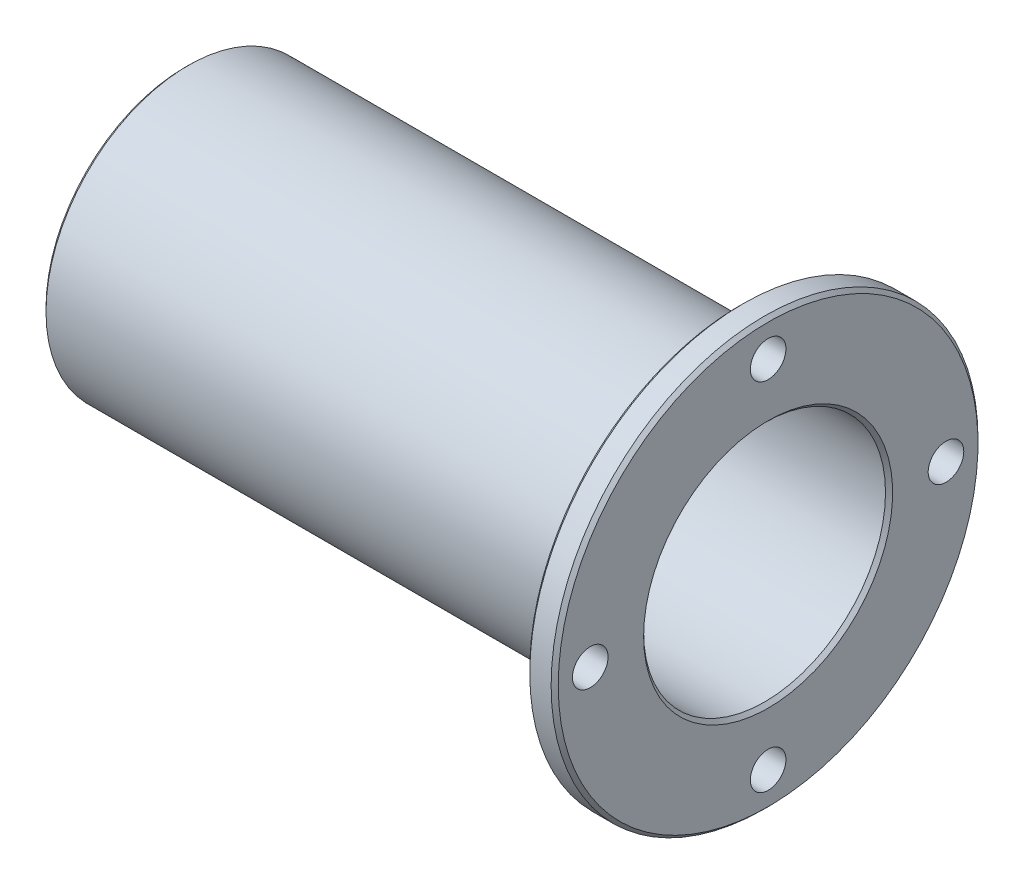
ISO-10303-21;
HEADER;
FILE_DESCRIPTION(('STEP AP214'),'2;1');
FILE_NAME('part.step','',(''),(''),'','','');
FILE_SCHEMA(('AUTOMOTIVE_DESIGN { 1 0 10303 214 1 1 1 1 }'));
ENDSEC;
DATA;
#1=APPLICATION_CONTEXT('core data for automotive mechanical design processes');
#2=APPLICATION_PROTOCOL_DEFINITION('international standard','automotive_design',2000,#1);
#3=PRODUCT_CONTEXT('',#1,'mechanical');
#4=PRODUCT('Part','Part','',(#3));
#5=PRODUCT_RELATED_PRODUCT_CATEGORY('part','',(#4));
#6=PRODUCT_DEFINITION_FORMATION('','',#4);
#7=PRODUCT_DEFINITION_CONTEXT('part definition',#1,'design');
#8=PRODUCT_DEFINITION('design','',#6,#7);
#9=PRODUCT_DEFINITION_SHAPE('','',#8);
#10=(LENGTH_UNIT() NAMED_UNIT(*) SI_UNIT(.MILLI.,.METRE.));
#11=(NAMED_UNIT(*) PLANE_ANGLE_UNIT() SI_UNIT($,.RADIAN.));
#12=(NAMED_UNIT(*) SI_UNIT($,.STERADIAN.) SOLID_ANGLE_UNIT());
#13=UNCERTAINTY_MEASURE_WITH_UNIT(LENGTH_MEASURE(1.E-05),#10,'distance_accuracy_value','');
#14=(GEOMETRIC_REPRESENTATION_CONTEXT(3) GLOBAL_UNCERTAINTY_ASSIGNED_CONTEXT((#13)) GLOBAL_UNIT_ASSIGNED_CONTEXT((#10,
#11,#12)) REPRESENTATION_CONTEXT('',''));
#15=CARTESIAN_POINT('',(0.,0.,0.));
#16=DIRECTION('',(0.,0.,1.));
#17=DIRECTION('',(1.,0.,0.));
#18=AXIS2_PLACEMENT_3D('',#15,#16,#17);
#19=CARTESIAN_POINT('',(0.,10.,0.));
#20=DIRECTION('',(1.,0.,0.));
#21=DIRECTION('',(0.,0.,-1.));
#22=AXIS2_PLACEMENT_3D('',#19,#20,#21);
#23=PLANE('',#22);
#24=CARTESIAN_POINT('',(0.,0.,0.));
#25=DIRECTION('',(1.,0.,0.));
#26=DIRECTION('',(0.,0.,-1.));
#27=AXIS2_PLACEMENT_3D('',#24,#25,#26);
#28=CIRCLE('',#27,19.5);
#29=CARTESIAN_POINT('',(0.,0.,-19.5));
#30=VERTEX_POINT('',#29);
#31=EDGE_CURVE('E128',#30,#30,#28,.F.);
#32=ORIENTED_EDGE('',*,*,#31,.T.);
#33=EDGE_LOOP('',(#32));
#34=FACE_BOUND('',#33,.T.);
#35=CARTESIAN_POINT('',(0.,0.,0.));
#36=DIRECTION('',(-1.,0.,0.));
#37=DIRECTION('',(0.,0.,1.));
#38=AXIS2_PLACEMENT_3D('',#35,#36,#37);
#39=CIRCLE('',#38,10.);
#40=CARTESIAN_POINT('',(0.,9.83375,-1.81586368912978));
#41=VERTEX_POINT('',#40);
#42=CARTESIAN_POINT('',(0.,1.81586368912978,-9.83375));
#43=VERTEX_POINT('',#42);
#44=EDGE_CURVE('E83',#41,#43,#39,.T.);
#45=ORIENTED_EDGE('',*,*,#44,.F.);
#46=CARTESIAN_POINT('',(0.,13.,0.));
#47=DIRECTION('',(-1.,0.,0.));
#48=DIRECTION('',(0.,0.,1.));
#49=AXIS2_PLACEMENT_3D('',#46,#47,#48);
#50=CIRCLE('',#49,3.65);
#51=CARTESIAN_POINT('',(0.,9.83375,1.81586368912978));
#52=VERTEX_POINT('',#51);
#53=EDGE_CURVE('E52',#52,#41,#50,.T.);
#54=ORIENTED_EDGE('',*,*,#53,.F.);
#55=CARTESIAN_POINT('',(0.,1.81586368912977,9.83375));
#56=VERTEX_POINT('',#55);
#57=EDGE_CURVE('E81',#56,#52,#39,.T.);
#58=ORIENTED_EDGE('',*,*,#57,.F.);
#59=CARTESIAN_POINT('',(0.,0.,13.));
#60=DIRECTION('',(-1.,0.,0.));
#61=DIRECTION('',(0.,0.,1.));
#62=AXIS2_PLACEMENT_3D('',#59,#60,#61);
#63=CIRCLE('',#62,3.65);
#64=CARTESIAN_POINT('',(0.,-1.81586368912978,9.83375));
#65=VERTEX_POINT('',#64);
#66=EDGE_CURVE('E58',#65,#56,#63,.T.);
#67=ORIENTED_EDGE('',*,*,#66,.F.);
#68=CARTESIAN_POINT('',(0.,-9.83375,1.81586368912978));
#69=VERTEX_POINT('',#68);
#70=EDGE_CURVE('E89',#69,#65,#39,.T.);
#71=ORIENTED_EDGE('',*,*,#70,.F.);
#72=CARTESIAN_POINT('',(0.,-13.,0.));
#73=DIRECTION('',(-1.,0.,0.));
#74=DIRECTION('',(0.,0.,1.));
#75=AXIS2_PLACEMENT_3D('',#72,#73,#74);
#76=CIRCLE('',#75,3.65);
#77=CARTESIAN_POINT('',(0.,-9.83375,-1.81586368912978));
#78=VERTEX_POINT('',#77);
#79=EDGE_CURVE('E410',#78,#69,#76,.T.);
#80=ORIENTED_EDGE('',*,*,#79,.F.);
#81=CARTESIAN_POINT('',(0.,-1.81586368912977,-9.83375));
#82=VERTEX_POINT('',#81);
#83=EDGE_CURVE('E91',#82,#78,#39,.T.);
#84=ORIENTED_EDGE('',*,*,#83,.F.);
#85=CARTESIAN_POINT('',(0.,0.,-13.));
#86=DIRECTION('',(-1.,0.,0.));
#87=DIRECTION('',(0.,0.,1.));
#88=AXIS2_PLACEMENT_3D('',#85,#86,#87);
#89=CIRCLE('',#88,3.65);
#90=EDGE_CURVE('E434',#43,#82,#89,.T.);
#91=ORIENTED_EDGE('',*,*,#90,.F.);
#92=EDGE_LOOP('',(#45,#54,#58,#67,#71,#80,#84,#91));
#93=FACE_BOUND('',#92,.T.);
#94=ADVANCED_FACE('F37',(#34,#93),#23,.F.);
#95=CARTESIAN_POINT('',(0.,0.,0.));
#96=DIRECTION('',(-1.,0.,0.));
#97=DIRECTION('',(0.,0.,1.));
#98=AXIS2_PLACEMENT_3D('',#95,#96,#97);
#99=CYLINDRICAL_SURFACE('',#98,10.);
#100=CARTESIAN_POINT('',(3.49999999999998,0.,0.));
#101=DIRECTION('',(-1.,0.,0.));
#102=DIRECTION('',(0.,0.,1.));
#103=AXIS2_PLACEMENT_3D('',#100,#101,#102);
#104=CIRCLE('',#103,10.);
#105=CARTESIAN_POINT('',(3.49999999999998,0.,10.));
#106=VERTEX_POINT('',#105);
#107=EDGE_CURVE('E125',#106,#106,#104,.F.);
#108=ORIENTED_EDGE('',*,*,#107,.T.);
#109=EDGE_LOOP('',(#108));
#110=FACE_BOUND('',#109,.T.);
#111=ORIENTED_EDGE('',*,*,#57,.T.);
#112=CARTESIAN_POINT('',(-0.0002,9.83369384461539,1.81616777043683));
#113=CARTESIAN_POINT('',(0.0328787074453799,9.84298247485663,1.76586869999737));
#114=CARTESIAN_POINT('',(0.0653133556671312,9.85196258783882,1.71509050066129));
#115=CARTESIAN_POINT('',(0.128675248379261,9.86927975905654,1.61246119724076));
#116=CARTESIAN_POINT('',(0.159601749786157,9.87761650145022,1.56060958183999));
#117=CARTESIAN_POINT('',(0.25021961324618,9.90173652876115,1.40251370575922));
#118=CARTESIAN_POINT('',(0.3072157008299,9.91648087756967,1.29452513394009));
#119=CARTESIAN_POINT('',(0.412008401666546,9.94300737345037,1.07206069061352));
#120=CARTESIAN_POINT('',(0.459680169335041,9.95474989248205,0.957520264658974));
#121=CARTESIAN_POINT('',(0.541093632656455,9.97447605265071,0.72353708546845));
#122=CARTESIAN_POINT('',(0.574884868167065,9.98247307611376,0.604113469027235));
#123=CARTESIAN_POINT('',(0.613686997977575,9.99157651562064,0.415825786808179));
#124=CARTESIAN_POINT('',(0.624809662141635,9.99416492827858,0.34827177800218));
#125=CARTESIAN_POINT('',(0.641226096347715,9.99797498582,0.212390020902549));
#126=CARTESIAN_POINT('',(0.646518770548608,9.99919637374971,0.144062129582799));
#127=CARTESIAN_POINT('',(0.650983860898503,10.0002271905596,0.00778456549395661));
#128=CARTESIAN_POINT('',(0.650208568201649,10.0000486831154,-0.0601633000237445));
#129=CARTESIAN_POINT('',(0.642702908742275,9.99831453758039,-0.195704816622554));
#130=CARTESIAN_POINT('',(0.635972736166017,9.99675894439581,-0.263298479181779));
#131=CARTESIAN_POINT('',(0.616926127332752,9.99232889917011,-0.397282549825774));
#132=CARTESIAN_POINT('',(0.604638915939702,9.98946134591503,-0.463677386597749));
#133=CARTESIAN_POINT('',(0.575000872607087,9.98248463259256,-0.595272016060319));
#134=CARTESIAN_POINT('',(0.557647567217013,9.97837486599692,-0.660471208428571));
#135=CARTESIAN_POINT('',(0.498630330019979,9.96424657656146,-0.854828811513095));
#136=CARTESIAN_POINT('',(0.45015503104972,9.95246155367515,-0.981823088470965));
#137=CARTESIAN_POINT('',(0.367341421754855,9.93172825990159,-1.16823231543496));
#138=CARTESIAN_POINT('',(0.337820361860381,9.92424709027715,-1.23008962809087));
#139=CARTESIAN_POINT('',(0.275951689702965,9.90833667551114,-1.35227772997223));
#140=CARTESIAN_POINT('',(0.243603597146367,9.89990726920045,-1.41260825755325));
#141=CARTESIAN_POINT('',(0.177065528722365,9.88230055834575,-1.53090225899771));
#142=CARTESIAN_POINT('',(0.142910759727775,9.87313647572071,-1.58888772303072));
#143=CARTESIAN_POINT('',(0.0726989004210404,9.85400609157192,-1.70350443935433));
#144=CARTESIAN_POINT('',(0.0366431867581044,9.84404036791372,-1.76013662962984));
#145=CARTESIAN_POINT('',(-0.000200000000194953,9.83369384461533,-1.81616777043713));
#146=B_SPLINE_CURVE_WITH_KNOTS('',3,(#112,#113,#114,#115,#116,#117,#118,#119,#120,#121,#122,
#123,#124,#125,#126,#127,#128,#129,#130,#131,#132,#133,#134,#135,#136,#137,#138,#139,#140,#141,
#142,#143,#144,#145),.UNSPECIFIED.,.F.,.F.,(4,2,2,2,2,2,2,2,2,2,2,2,2,2,2,2,4),(0.,
0.182728437677652,0.365546016717099,0.734086438199131,1.10726643222343,1.47910271941134,
1.68440947502773,1.88975481479546,2.09333253685044,2.29690362056161,2.49941633946095,
2.70202809823218,3.11003246287906,3.31683113680386,3.52366501297412,3.72737432218258,
3.93093808064405),.UNSPECIFIED.);
#147=EDGE_CURVE('E11',#52,#41,#146,.T.);
#148=ORIENTED_EDGE('',*,*,#147,.T.);
#149=ORIENTED_EDGE('',*,*,#44,.T.);
#150=CARTESIAN_POINT('',(-0.0002,1.81616777043683,-9.83369384461539));
#151=CARTESIAN_POINT('',(0.0328787074453799,1.76586869999737,-9.84298247485663));
#152=CARTESIAN_POINT('',(0.0653133556671312,1.71509050066129,-9.85196258783882));
#153=CARTESIAN_POINT('',(0.128675248379261,1.61246119724076,-9.86927975905654));
#154=CARTESIAN_POINT('',(0.159601749786157,1.56060958183999,-9.87761650145022));
#155=CARTESIAN_POINT('',(0.25021961324618,1.40251370575922,-9.90173652876115));
#156=CARTESIAN_POINT('',(0.3072157008299,1.29452513394009,-9.91648087756967));
#157=CARTESIAN_POINT('',(0.412008401666545,1.07206069061352,-9.94300737345037));
#158=CARTESIAN_POINT('',(0.45968016933504,0.957520264658974,-9.95474989248205));
#159=CARTESIAN_POINT('',(0.541093632656454,0.72353708546845,-9.97447605265071));
#160=CARTESIAN_POINT('',(0.574884868167064,0.604113469027235,-9.98247307611376));
#161=CARTESIAN_POINT('',(0.613686997977575,0.41582578680818,-9.99157651562064));
#162=CARTESIAN_POINT('',(0.624809662141634,0.348271778002181,-9.99416492827858));
#163=CARTESIAN_POINT('',(0.641226096347714,0.21239002090255,-9.99797498582));
#164=CARTESIAN_POINT('',(0.646518770548608,0.1440621295828,-9.99919637374971));
#165=CARTESIAN_POINT('',(0.650983860898502,0.00778456549395779,-10.0002271905596));
#166=CARTESIAN_POINT('',(0.650208568201648,-0.0601633000237433,-10.0000486831154));
#167=CARTESIAN_POINT('',(0.642702908742274,-0.195704816622553,-9.99831453758039));
#168=CARTESIAN_POINT('',(0.635972736166017,-0.263298479181778,-9.99675894439581));
#169=CARTESIAN_POINT('',(0.616926127332751,-0.397282549825773,-9.99232889917011));
#170=CARTESIAN_POINT('',(0.6046389159397,-0.463677386597747,-9.98946134591503));
#171=CARTESIAN_POINT('',(0.575000872607085,-0.595272016060317,-9.98248463259256));
#172=CARTESIAN_POINT('',(0.557647567217014,-0.66047120842857,-9.97837486599692));
#173=CARTESIAN_POINT('',(0.498630330019982,-0.854828811513095,-9.96424657656147));
#174=CARTESIAN_POINT('',(0.450155031049722,-0.981823088470965,-9.95246155367515));
#175=CARTESIAN_POINT('',(0.367341421754856,-1.16823231543496,-9.93172825990159));
#176=CARTESIAN_POINT('',(0.337820361860381,-1.23008962809087,-9.92424709027715));
#177=CARTESIAN_POINT('',(0.275951689702965,-1.35227772997223,-9.90833667551114));
#178=CARTESIAN_POINT('',(0.243603597146367,-1.41260825755325,-9.89990726920045));
#179=CARTESIAN_POINT('',(0.177065528722365,-1.53090225899771,-9.88230055834575));
#180=CARTESIAN_POINT('',(0.142910759727775,-1.58888772303072,-9.87313647572071));
#181=CARTESIAN_POINT('',(0.0726989004210404,-1.70350443935433,-9.85400609157192));
#182=CARTESIAN_POINT('',(0.0366431867581042,-1.76013662962984,-9.84404036791372));
#183=CARTESIAN_POINT('',(-0.000200000000195297,-1.81616777043713,-9.83369384461533));
#184=B_SPLINE_CURVE_WITH_KNOTS('',3,(#150,#151,#152,#153,#154,#155,#156,#157,#158,#159,#160,
#161,#162,#163,#164,#165,#166,#167,#168,#169,#170,#171,#172,#173,#174,#175,#176,#177,#178,#179,
#180,#181,#182,#183),.UNSPECIFIED.,.F.,.F.,(4,2,2,2,2,2,2,2,2,2,2,2,2,2,2,2,4),(0.,
0.182728437677652,0.365546016717099,0.734086438199131,1.10726643222343,1.47910271941133,
1.68440947502773,1.88975481479546,2.09333253685044,2.29690362056161,2.49941633946095,
2.70202809823217,3.11003246287905,3.31683113680386,3.52366501297412,3.72737432218258,
3.93093808064405),.UNSPECIFIED.);
#185=EDGE_CURVE('E134',#43,#82,#184,.T.);
#186=ORIENTED_EDGE('',*,*,#185,.T.);
#187=ORIENTED_EDGE('',*,*,#83,.T.);
#188=CARTESIAN_POINT('',(-0.000200000000195393,-9.83369384461533,-1.81616777043713));
#189=CARTESIAN_POINT('',(0.0328787074451947,-9.84298247485658,-1.76586869999766));
#190=CARTESIAN_POINT('',(0.0653133556669557,-9.85196258783877,-1.71509050066157));
#191=CARTESIAN_POINT('',(0.128675248379105,-9.86927975905649,-1.61246119724102));
#192=CARTESIAN_POINT('',(0.15960174978601,-9.87761650145018,-1.56060958184024));
#193=CARTESIAN_POINT('',(0.250219613246061,-9.90173652876112,-1.40251370575944));
#194=CARTESIAN_POINT('',(0.3072157008298,-9.91648087756964,-1.29452513394029));
#195=CARTESIAN_POINT('',(0.41200840166648,-9.94300737345035,-1.07206069061368));
#196=CARTESIAN_POINT('',(0.459680169334989,-9.95474989248204,-0.957520264659105));
#197=CARTESIAN_POINT('',(0.54109363265643,-9.9744760526507,-0.72353708546853));
#198=CARTESIAN_POINT('',(0.574884868167051,-9.98247307611376,-0.604113469027289));
#199=CARTESIAN_POINT('',(0.613686997977571,-9.99157651562064,-0.415825786808206));
#200=CARTESIAN_POINT('',(0.624809662141632,-9.99416492827858,-0.348271778002205));
#201=CARTESIAN_POINT('',(0.641226096347713,-9.99797498582,-0.212390020902572));
#202=CARTESIAN_POINT('',(0.646518770548607,-9.99919637374971,-0.14406212958282));
#203=CARTESIAN_POINT('',(0.650983860898502,-10.0002271905596,-0.00778456549397483));
#204=CARTESIAN_POINT('',(0.650208568201649,-10.0000486831154,0.0601633000237276));
#205=CARTESIAN_POINT('',(0.642702908742276,-9.99831453758039,0.19570481662254));
#206=CARTESIAN_POINT('',(0.635972736166019,-9.99675894439581,0.263298479181767));
#207=CARTESIAN_POINT('',(0.616926127332753,-9.99232889917011,0.397282549825764));
#208=CARTESIAN_POINT('',(0.604638915939703,-9.98946134591503,0.46367738659774));
#209=CARTESIAN_POINT('',(0.575000872607088,-9.98248463259256,0.595272016060312));
#210=CARTESIAN_POINT('',(0.557647567217014,-9.97837486599692,0.660471208428566));
#211=CARTESIAN_POINT('',(0.498630330019979,-9.96424657656146,0.854828811513094));
#212=CARTESIAN_POINT('',(0.45015503104972,-9.95246155367515,0.981823088470967));
#213=CARTESIAN_POINT('',(0.367341421754866,-9.93172825990159,1.16823231543493));
#214=CARTESIAN_POINT('',(0.337820361860405,-9.92424709027716,1.23008962809082));
#215=CARTESIAN_POINT('',(0.27595168970302,-9.90833667551115,1.35227772997213));
#216=CARTESIAN_POINT('',(0.243603597146437,-9.89990726920047,1.41260825755312));
#217=CARTESIAN_POINT('',(0.177065528722469,-9.88230055834578,1.53090225899753));
#218=CARTESIAN_POINT('',(0.142910759727896,-9.87313647572074,1.58888772303051));
#219=CARTESIAN_POINT('',(0.0726989004211967,-9.85400609157196,1.70350443935408));
#220=CARTESIAN_POINT('',(0.0366431867582795,-9.84404036791377,1.76013662962957));
#221=CARTESIAN_POINT('',(-0.000199999999999425,-9.83369384461539,1.81616777043683));
#222=B_SPLINE_CURVE_WITH_KNOTS('',3,(#188,#189,#190,#191,#192,#193,#194,#195,#196,#197,#198,
#199,#200,#201,#202,#203,#204,#205,#206,#207,#208,#209,#210,#211,#212,#213,#214,#215,#216,#217,
#218,#219,#220,#221),.UNSPECIFIED.,.F.,.F.,(4,2,2,2,2,2,2,2,2,2,2,2,2,2,2,2,4),(0.,
0.182728437677692,0.365546016717178,0.734086438199293,1.10726643222368,1.47910271941167,
1.68440947502807,1.8897548147958,2.09333253685079,2.29690362056196,2.4994163394613,
2.70202809823253,3.11003246287942,3.31683113680413,3.5236650129743,3.72737432218267,
3.93093808064405),.UNSPECIFIED.);
#223=EDGE_CURVE('E142',#78,#69,#222,.T.);
#224=ORIENTED_EDGE('',*,*,#223,.T.);
#225=ORIENTED_EDGE('',*,*,#70,.T.);
#226=CARTESIAN_POINT('',(-0.000200000000195087,-1.81616777043713,9.83369384461533));
#227=CARTESIAN_POINT('',(0.0328787074451947,-1.76586869999766,9.84298247485658));
#228=CARTESIAN_POINT('',(0.0653133556669556,-1.71509050066157,9.85196258783877));
#229=CARTESIAN_POINT('',(0.128675248379105,-1.61246119724102,9.86927975905649));
#230=CARTESIAN_POINT('',(0.159601749786009,-1.56060958184024,9.87761650145019));
#231=CARTESIAN_POINT('',(0.25021961324606,-1.40251370575944,9.90173652876112));
#232=CARTESIAN_POINT('',(0.307215700829798,-1.29452513394029,9.91648087756964));
#233=CARTESIAN_POINT('',(0.412008401666477,-1.07206069061368,9.94300737345035));
#234=CARTESIAN_POINT('',(0.459680169334989,-0.957520264659105,9.95474989248204));
#235=CARTESIAN_POINT('',(0.54109363265643,-0.723537085468531,9.9744760526507));
#236=CARTESIAN_POINT('',(0.574884868167051,-0.60411346902729,9.98247307611376));
#237=CARTESIAN_POINT('',(0.61368699797757,-0.415825786808207,9.99157651562064));
#238=CARTESIAN_POINT('',(0.624809662141631,-0.348271778002206,9.99416492827858));
#239=CARTESIAN_POINT('',(0.641226096347713,-0.212390020902573,9.99797498582));
#240=CARTESIAN_POINT('',(0.646518770548606,-0.144062129582821,9.99919637374971));
#241=CARTESIAN_POINT('',(0.650983860898502,-0.00778456549397607,10.0002271905596));
#242=CARTESIAN_POINT('',(0.650208568201649,0.0601633000237264,10.0000486831154));
#243=CARTESIAN_POINT('',(0.642702908742276,0.195704816622539,9.99831453758039));
#244=CARTESIAN_POINT('',(0.635972736166019,0.263298479181765,9.99675894439581));
#245=CARTESIAN_POINT('',(0.616926127332753,0.397282549825762,9.99232889917011));
#246=CARTESIAN_POINT('',(0.604638915939703,0.463677386597738,9.98946134591503));
#247=CARTESIAN_POINT('',(0.575000872607087,0.595272016060311,9.98248463259256));
#248=CARTESIAN_POINT('',(0.557647567217014,0.660471208428564,9.97837486599692));
#249=CARTESIAN_POINT('',(0.49863033001998,0.854828811513092,9.96424657656146));
#250=CARTESIAN_POINT('',(0.45015503104972,0.981823088470965,9.95246155367515));
#251=CARTESIAN_POINT('',(0.367341421754866,1.16823231543493,9.93172825990159));
#252=CARTESIAN_POINT('',(0.337820361860405,1.23008962809082,9.92424709027716));
#253=CARTESIAN_POINT('',(0.27595168970302,1.35227772997212,9.90833667551115));
#254=CARTESIAN_POINT('',(0.243603597146437,1.41260825755312,9.89990726920047));
#255=CARTESIAN_POINT('',(0.177065528722469,1.53090225899753,9.88230055834578));
#256=CARTESIAN_POINT('',(0.142910759727896,1.58888772303051,9.87313647572074));
#257=CARTESIAN_POINT('',(0.0726989004211969,1.70350443935408,9.85400609157196));
#258=CARTESIAN_POINT('',(0.0366431867582798,1.76013662962957,9.84404036791377));
#259=CARTESIAN_POINT('',(-0.000199999999999313,1.81616777043683,9.83369384461539));
#260=B_SPLINE_CURVE_WITH_KNOTS('',3,(#226,#227,#228,#229,#230,#231,#232,#233,#234,#235,#236,
#237,#238,#239,#240,#241,#242,#243,#244,#245,#246,#247,#248,#249,#250,#251,#252,#253,#254,#255,
#256,#257,#258,#259),.UNSPECIFIED.,.F.,.F.,(4,2,2,2,2,2,2,2,2,2,2,2,2,2,2,2,4),(0.,
0.182728437677691,0.365546016717178,0.734086438199292,1.10726643222368,1.47910271941166,
1.68440947502806,1.8897548147958,2.09333253685078,2.29690362056195,2.4994163394613,
2.70202809823253,3.11003246287942,3.31683113680413,3.52366501297429,3.72737432218267,
3.93093808064405),.UNSPECIFIED.);
#261=EDGE_CURVE('E46',#65,#56,#260,.T.);
#262=ORIENTED_EDGE('',*,*,#261,.T.);
#263=EDGE_LOOP('',(#111,#148,#149,#186,#187,#224,#225,#262));
#264=FACE_BOUND('',#263,.T.);
#265=ADVANCED_FACE('F87',(#110,#264),#99,.F.);
#266=CARTESIAN_POINT('',(4.,10.,0.));
#267=DIRECTION('',(-1.,0.,0.));
#268=DIRECTION('',(0.,0.,1.));
#269=AXIS2_PLACEMENT_3D('',#266,#267,#268);
#270=PLANE('',#269);
#271=CARTESIAN_POINT('',(4.,13.,0.));
#272=DIRECTION('',(-1.,0.,0.));
#273=DIRECTION('',(0.,0.,1.));
#274=AXIS2_PLACEMENT_3D('',#271,#272,#273);
#275=CIRCLE('',#274,1.59999999999999);
#276=CARTESIAN_POINT('',(4.,13.,1.59999999999999));
#277=VERTEX_POINT('',#276);
#278=EDGE_CURVE('E41',#277,#277,#275,.T.);
#279=ORIENTED_EDGE('',*,*,#278,.T.);
#280=EDGE_LOOP('',(#279));
#281=FACE_BOUND('',#280,.T.);
#282=CARTESIAN_POINT('',(4.,0.,13.));
#283=DIRECTION('',(-1.,0.,0.));
#284=DIRECTION('',(0.,0.,1.));
#285=AXIS2_PLACEMENT_3D('',#282,#283,#284);
#286=CIRCLE('',#285,1.59999999999999);
#287=CARTESIAN_POINT('',(4.,0.,14.6));
#288=VERTEX_POINT('',#287);
#289=EDGE_CURVE('E195',#288,#288,#286,.T.);
#290=ORIENTED_EDGE('',*,*,#289,.T.);
#291=EDGE_LOOP('',(#290));
#292=FACE_BOUND('',#291,.T.);
#293=CARTESIAN_POINT('',(4.,-13.,0.));
#294=DIRECTION('',(-1.,0.,0.));
#295=DIRECTION('',(0.,0.,1.));
#296=AXIS2_PLACEMENT_3D('',#293,#294,#295);
#297=CIRCLE('',#296,1.59999999999999);
#298=CARTESIAN_POINT('',(4.,-13.,1.59999999999999));
#299=VERTEX_POINT('',#298);
#300=EDGE_CURVE('E199',#299,#299,#297,.T.);
#301=ORIENTED_EDGE('',*,*,#300,.T.);
#302=EDGE_LOOP('',(#301));
#303=FACE_BOUND('',#302,.T.);
#304=CARTESIAN_POINT('',(4.,0.,-13.));
#305=DIRECTION('',(-1.,0.,0.));
#306=DIRECTION('',(0.,0.,1.));
#307=AXIS2_PLACEMENT_3D('',#304,#305,#306);
#308=CIRCLE('',#307,1.59999999999999);
#309=CARTESIAN_POINT('',(4.,0.,-11.4));
#310=VERTEX_POINT('',#309);
#311=EDGE_CURVE('E92',#310,#310,#308,.T.);
#312=ORIENTED_EDGE('',*,*,#311,.T.);
#313=EDGE_LOOP('',(#312));
#314=FACE_BOUND('',#313,.T.);
#315=CARTESIAN_POINT('',(4.,0.,0.));
#316=DIRECTION('',(-1.,0.,0.));
#317=DIRECTION('',(0.,0.,1.));
#318=AXIS2_PLACEMENT_3D('',#315,#316,#317);
#319=CIRCLE('',#318,10.5);
#320=CARTESIAN_POINT('',(4.,0.,10.5));
#321=VERTEX_POINT('',#320);
#322=EDGE_CURVE('E122',#321,#321,#319,.T.);
#323=ORIENTED_EDGE('',*,*,#322,.T.);
#324=EDGE_LOOP('',(#323));
#325=FACE_BOUND('',#324,.T.);
#326=CARTESIAN_POINT('',(4.,0.,0.));
#327=DIRECTION('',(-1.,0.,0.));
#328=DIRECTION('',(0.,0.,1.));
#329=AXIS2_PLACEMENT_3D('',#326,#327,#328);
#330=CIRCLE('',#329,17.);
#331=CARTESIAN_POINT('',(4.,0.,17.));
#332=VERTEX_POINT('',#331);
#333=EDGE_CURVE('E101',#332,#332,#330,.T.);
#334=ORIENTED_EDGE('',*,*,#333,.F.);
#335=EDGE_LOOP('',(#334));
#336=FACE_BOUND('',#335,.T.);
#337=ADVANCED_FACE('F181',(#281,#292,#303,#314,#325,#336),#270,.F.);
#338=CARTESIAN_POINT('',(0.,0.,0.));
#339=DIRECTION('',(-1.,0.,0.));
#340=DIRECTION('',(0.,0.,1.));
#341=AXIS2_PLACEMENT_3D('',#338,#339,#340);
#342=CYLINDRICAL_SURFACE('',#341,17.);
#343=CARTESIAN_POINT('',(81.5,0.,0.));
#344=DIRECTION('',(-1.,0.,0.));
#345=DIRECTION('',(0.,0.,1.));
#346=AXIS2_PLACEMENT_3D('',#343,#344,#345);
#347=CIRCLE('',#346,17.);
#348=CARTESIAN_POINT('',(81.5,0.,17.));
#349=VERTEX_POINT('',#348);
#350=EDGE_CURVE('E119',#349,#349,#347,.F.);
#351=ORIENTED_EDGE('',*,*,#350,.T.);
#352=EDGE_LOOP('',(#351));
#353=FACE_BOUND('',#352,.T.);
#354=ORIENTED_EDGE('',*,*,#333,.T.);
#355=EDGE_LOOP('',(#354));
#356=FACE_BOUND('',#355,.T.);
#357=ADVANCED_FACE('F178',(#353,#356),#342,.F.);
#358=CARTESIAN_POINT('',(82.,30.,0.));
#359=DIRECTION('',(-1.,0.,0.));
#360=DIRECTION('',(0.,0.,1.));
#361=AXIS2_PLACEMENT_3D('',#358,#359,#360);
#362=PLANE('',#361);
#363=CARTESIAN_POINT('',(82.,-25.,0.));
#364=DIRECTION('',(1.,0.,0.));
#365=DIRECTION('',(0.,0.,-1.));
#366=AXIS2_PLACEMENT_3D('',#363,#364,#365);
#367=CIRCLE('',#366,2.5);
#368=CARTESIAN_POINT('',(82.,-25.,-2.5));
#369=VERTEX_POINT('',#368);
#370=EDGE_CURVE('E464',#369,#369,#367,.T.);
#371=ORIENTED_EDGE('',*,*,#370,.F.);
#372=EDGE_LOOP('',(#371));
#373=FACE_BOUND('',#372,.T.);
#374=CARTESIAN_POINT('',(82.,0.,25.));
#375=DIRECTION('',(1.,0.,0.));
#376=DIRECTION('',(0.,0.,-1.));
#377=AXIS2_PLACEMENT_3D('',#374,#375,#376);
#378=CIRCLE('',#377,2.5);
#379=CARTESIAN_POINT('',(82.,0.,22.5));
#380=VERTEX_POINT('',#379);
#381=EDGE_CURVE('E458',#380,#380,#378,.T.);
#382=ORIENTED_EDGE('',*,*,#381,.F.);
#383=EDGE_LOOP('',(#382));
#384=FACE_BOUND('',#383,.T.);
#385=CARTESIAN_POINT('',(82.,0.,-25.));
#386=DIRECTION('',(1.,0.,0.));
#387=DIRECTION('',(0.,0.,-1.));
#388=AXIS2_PLACEMENT_3D('',#385,#386,#387);
#389=CIRCLE('',#388,2.5);
#390=CARTESIAN_POINT('',(82.,0.,-27.5));
#391=VERTEX_POINT('',#390);
#392=EDGE_CURVE('E452',#391,#391,#389,.T.);
#393=ORIENTED_EDGE('',*,*,#392,.F.);
#394=EDGE_LOOP('',(#393));
#395=FACE_BOUND('',#394,.T.);
#396=CARTESIAN_POINT('',(82.,25.,0.));
#397=DIRECTION('',(1.,0.,0.));
#398=DIRECTION('',(0.,0.,-1.));
#399=AXIS2_PLACEMENT_3D('',#396,#397,#398);
#400=CIRCLE('',#399,2.5);
#401=CARTESIAN_POINT('',(82.,25.,-2.5));
#402=VERTEX_POINT('',#401);
#403=EDGE_CURVE('E446',#402,#402,#400,.T.);
#404=ORIENTED_EDGE('',*,*,#403,.F.);
#405=EDGE_LOOP('',(#404));
#406=FACE_BOUND('',#405,.T.);
#407=CARTESIAN_POINT('',(82.,0.,0.));
#408=DIRECTION('',(-1.,0.,0.));
#409=DIRECTION('',(0.,0.,1.));
#410=AXIS2_PLACEMENT_3D('',#407,#408,#409);
#411=CIRCLE('',#410,29.5);
#412=CARTESIAN_POINT('',(82.,0.,29.5));
#413=VERTEX_POINT('',#412);
#414=EDGE_CURVE('E116',#413,#413,#411,.F.);
#415=ORIENTED_EDGE('',*,*,#414,.T.);
#416=EDGE_LOOP('',(#415));
#417=FACE_BOUND('',#416,.T.);
#418=CARTESIAN_POINT('',(82.,0.,0.));
#419=DIRECTION('',(-1.,0.,0.));
#420=DIRECTION('',(0.,0.,1.));
#421=AXIS2_PLACEMENT_3D('',#418,#419,#420);
#422=CIRCLE('',#421,17.5);
#423=CARTESIAN_POINT('',(82.,0.,17.5));
#424=VERTEX_POINT('',#423);
#425=EDGE_CURVE('E113',#424,#424,#422,.T.);
#426=ORIENTED_EDGE('',*,*,#425,.T.);
#427=EDGE_LOOP('',(#426));
#428=FACE_BOUND('',#427,.T.);
#429=ADVANCED_FACE('F174',(#373,#384,#395,#406,#417,#428),#362,.F.);
#430=CARTESIAN_POINT('',(0.,0.,0.));
#431=DIRECTION('',(-1.,0.,0.));
#432=DIRECTION('',(0.,0.,1.));
#433=AXIS2_PLACEMENT_3D('',#430,#431,#432);
#434=CYLINDRICAL_SURFACE('',#433,30.);
#435=CARTESIAN_POINT('',(78.5,0.,0.));
#436=DIRECTION('',(1.,0.,0.));
#437=DIRECTION('',(0.,0.,-1.));
#438=AXIS2_PLACEMENT_3D('',#435,#436,#437);
#439=CIRCLE('',#438,30.);
#440=CARTESIAN_POINT('',(78.5,0.,-30.));
#441=VERTEX_POINT('',#440);
#442=EDGE_CURVE('E110',#441,#441,#439,.T.);
#443=ORIENTED_EDGE('',*,*,#442,.T.);
#444=EDGE_LOOP('',(#443));
#445=FACE_BOUND('',#444,.T.);
#446=CARTESIAN_POINT('',(81.5,0.,0.));
#447=DIRECTION('',(-1.,0.,0.));
#448=DIRECTION('',(0.,0.,1.));
#449=AXIS2_PLACEMENT_3D('',#446,#447,#448);
#450=CIRCLE('',#449,30.);
#451=CARTESIAN_POINT('',(81.5,0.,30.));
#452=VERTEX_POINT('',#451);
#453=EDGE_CURVE('E107',#452,#452,#450,.T.);
#454=ORIENTED_EDGE('',*,*,#453,.T.);
#455=EDGE_LOOP('',(#454));
#456=FACE_BOUND('',#455,.T.);
#457=ADVANCED_FACE('F170',(#445,#456),#434,.T.);
#458=CARTESIAN_POINT('',(78.,20.,0.));
#459=DIRECTION('',(1.,0.,0.));
#460=DIRECTION('',(0.,0.,-1.));
#461=AXIS2_PLACEMENT_3D('',#458,#459,#460);
#462=PLANE('',#461);
#463=CARTESIAN_POINT('',(78.,-25.,0.));
#464=DIRECTION('',(1.,0.,0.));
#465=DIRECTION('',(0.,0.,-1.));
#466=AXIS2_PLACEMENT_3D('',#463,#464,#465);
#467=CIRCLE('',#466,2.5);
#468=CARTESIAN_POINT('',(78.,-25.,-2.5));
#469=VERTEX_POINT('',#468);
#470=EDGE_CURVE('E461',#469,#469,#467,.F.);
#471=ORIENTED_EDGE('',*,*,#470,.F.);
#472=EDGE_LOOP('',(#471));
#473=FACE_BOUND('',#472,.T.);
#474=CARTESIAN_POINT('',(78.,0.,25.));
#475=DIRECTION('',(1.,0.,0.));
#476=DIRECTION('',(0.,0.,-1.));
#477=AXIS2_PLACEMENT_3D('',#474,#475,#476);
#478=CIRCLE('',#477,2.5);
#479=CARTESIAN_POINT('',(78.,0.,22.5));
#480=VERTEX_POINT('',#479);
#481=EDGE_CURVE('E455',#480,#480,#478,.F.);
#482=ORIENTED_EDGE('',*,*,#481,.F.);
#483=EDGE_LOOP('',(#482));
#484=FACE_BOUND('',#483,.T.);
#485=CARTESIAN_POINT('',(78.,0.,-25.));
#486=DIRECTION('',(1.,0.,0.));
#487=DIRECTION('',(0.,0.,-1.));
#488=AXIS2_PLACEMENT_3D('',#485,#486,#487);
#489=CIRCLE('',#488,2.5);
#490=CARTESIAN_POINT('',(78.,0.,-27.5));
#491=VERTEX_POINT('',#490);
#492=EDGE_CURVE('E449',#491,#491,#489,.F.);
#493=ORIENTED_EDGE('',*,*,#492,.F.);
#494=EDGE_LOOP('',(#493));
#495=FACE_BOUND('',#494,.T.);
#496=CARTESIAN_POINT('',(78.,25.,0.));
#497=DIRECTION('',(1.,0.,0.));
#498=DIRECTION('',(0.,0.,-1.));
#499=AXIS2_PLACEMENT_3D('',#496,#497,#498);
#500=CIRCLE('',#499,2.5);
#501=CARTESIAN_POINT('',(78.,25.,-2.5));
#502=VERTEX_POINT('',#501);
#503=EDGE_CURVE('E85',#502,#502,#500,.F.);
#504=ORIENTED_EDGE('',*,*,#503,.F.);
#505=EDGE_LOOP('',(#504));
#506=FACE_BOUND('',#505,.T.);
#507=CARTESIAN_POINT('',(78.,0.,0.));
#508=DIRECTION('',(1.,0.,0.));
#509=DIRECTION('',(0.,0.,-1.));
#510=AXIS2_PLACEMENT_3D('',#507,#508,#509);
#511=CIRCLE('',#510,29.5);
#512=CARTESIAN_POINT('',(78.,0.,-29.5));
#513=VERTEX_POINT('',#512);
#514=EDGE_CURVE('E104',#513,#513,#511,.F.);
#515=ORIENTED_EDGE('',*,*,#514,.T.);
#516=EDGE_LOOP('',(#515));
#517=FACE_BOUND('',#516,.T.);
#518=CARTESIAN_POINT('',(78.,0.,0.));
#519=DIRECTION('',(-1.,0.,0.));
#520=DIRECTION('',(0.,0.,1.));
#521=AXIS2_PLACEMENT_3D('',#518,#519,#520);
#522=CIRCLE('',#521,20.);
#523=CARTESIAN_POINT('',(78.,0.,20.));
#524=VERTEX_POINT('',#523);
#525=EDGE_CURVE('E96',#524,#524,#522,.T.);
#526=ORIENTED_EDGE('',*,*,#525,.F.);
#527=EDGE_LOOP('',(#526));
#528=FACE_BOUND('',#527,.T.);
#529=ADVANCED_FACE('F166',(#473,#484,#495,#506,#517,#528),#462,.F.);
#530=CARTESIAN_POINT('',(0.,0.,0.));
#531=DIRECTION('',(-1.,0.,0.));
#532=DIRECTION('',(0.,0.,1.));
#533=AXIS2_PLACEMENT_3D('',#530,#531,#532);
#534=CYLINDRICAL_SURFACE('',#533,20.);
#535=CARTESIAN_POINT('',(0.500000000000028,0.,0.));
#536=DIRECTION('',(1.,0.,0.));
#537=DIRECTION('',(0.,0.,-1.));
#538=AXIS2_PLACEMENT_3D('',#535,#536,#537);
#539=CIRCLE('',#538,20.);
#540=CARTESIAN_POINT('',(0.500000000000028,0.,-20.));
#541=VERTEX_POINT('',#540);
#542=EDGE_CURVE('E131',#541,#541,#539,.T.);
#543=ORIENTED_EDGE('',*,*,#542,.T.);
#544=EDGE_LOOP('',(#543));
#545=FACE_BOUND('',#544,.T.);
#546=ORIENTED_EDGE('',*,*,#525,.T.);
#547=EDGE_LOOP('',(#546));
#548=FACE_BOUND('',#547,.T.);
#549=ADVANCED_FACE('F162',(#545,#548),#534,.T.);
#550=CARTESIAN_POINT('',(78.,0.,0.));
#551=DIRECTION('',(1.,0.,0.));
#552=DIRECTION('',(0.,0.,-1.));
#553=AXIS2_PLACEMENT_3D('',#550,#551,#552);
#554=CONICAL_SURFACE('',#553,29.5,0.785398163397435);
#555=ORIENTED_EDGE('',*,*,#442,.F.);
#556=EDGE_LOOP('',(#555));
#557=FACE_BOUND('',#556,.T.);
#558=ORIENTED_EDGE('',*,*,#514,.F.);
#559=EDGE_LOOP('',(#558));
#560=FACE_BOUND('',#559,.T.);
#561=ADVANCED_FACE('F165',(#557,#560),#554,.T.);
#562=CARTESIAN_POINT('',(81.5,0.,0.));
#563=DIRECTION('',(-1.,0.,0.));
#564=DIRECTION('',(0.,0.,1.));
#565=AXIS2_PLACEMENT_3D('',#562,#563,#564);
#566=CONICAL_SURFACE('',#565,30.,0.785398163397452);
#567=ORIENTED_EDGE('',*,*,#414,.F.);
#568=EDGE_LOOP('',(#567));
#569=FACE_BOUND('',#568,.T.);
#570=ORIENTED_EDGE('',*,*,#453,.F.);
#571=EDGE_LOOP('',(#570));
#572=FACE_BOUND('',#571,.T.);
#573=ADVANCED_FACE('F217',(#569,#572),#566,.T.);
#574=CARTESIAN_POINT('',(82.,0.,0.));
#575=DIRECTION('',(1.,0.,0.));
#576=DIRECTION('',(0.,0.,-1.));
#577=AXIS2_PLACEMENT_3D('',#574,#575,#576);
#578=CONICAL_SURFACE('',#577,17.5,0.785398163397448);
#579=ORIENTED_EDGE('',*,*,#350,.F.);
#580=EDGE_LOOP('',(#579));
#581=FACE_BOUND('',#580,.T.);
#582=ORIENTED_EDGE('',*,*,#425,.F.);
#583=EDGE_LOOP('',(#582));
#584=FACE_BOUND('',#583,.T.);
#585=ADVANCED_FACE('F210',(#581,#584),#578,.F.);
#586=CARTESIAN_POINT('',(4.,0.,0.));
#587=DIRECTION('',(1.,0.,0.));
#588=DIRECTION('',(0.,0.,-1.));
#589=AXIS2_PLACEMENT_3D('',#586,#587,#588);
#590=CONICAL_SURFACE('',#589,10.5,0.785398163397441);
#591=ORIENTED_EDGE('',*,*,#107,.F.);
#592=EDGE_LOOP('',(#591));
#593=FACE_BOUND('',#592,.T.);
#594=ORIENTED_EDGE('',*,*,#322,.F.);
#595=EDGE_LOOP('',(#594));
#596=FACE_BOUND('',#595,.T.);
#597=ADVANCED_FACE('F208',(#593,#596),#590,.F.);
#598=CARTESIAN_POINT('',(0.,0.,0.));
#599=DIRECTION('',(1.,0.,0.));
#600=DIRECTION('',(0.,0.,-1.));
#601=AXIS2_PLACEMENT_3D('',#598,#599,#600);
#602=CONICAL_SURFACE('',#601,19.5,0.785398163397448);
#603=ORIENTED_EDGE('',*,*,#542,.F.);
#604=EDGE_LOOP('',(#603));
#605=FACE_BOUND('',#604,.T.);
#606=ORIENTED_EDGE('',*,*,#31,.F.);
#607=EDGE_LOOP('',(#606));
#608=FACE_BOUND('',#607,.T.);
#609=ADVANCED_FACE('F39',(#605,#608),#602,.T.);
#610=CARTESIAN_POINT('',(0.,0.,-13.));
#611=DIRECTION('',(-1.,0.,0.));
#612=DIRECTION('',(0.,0.,1.));
#613=AXIS2_PLACEMENT_3D('',#610,#611,#612);
#614=CYLINDRICAL_SURFACE('',#613,1.59999999999999);
#615=CARTESIAN_POINT('',(2.05000000000001,0.,-13.));
#616=DIRECTION('',(-1.,0.,0.));
#617=DIRECTION('',(0.,0.,1.));
#618=AXIS2_PLACEMENT_3D('',#615,#616,#617);
#619=CIRCLE('',#618,1.59999999999999);
#620=CARTESIAN_POINT('',(2.05000000000001,0.,-11.4));
#621=VERTEX_POINT('',#620);
#622=EDGE_CURVE('E97',#621,#621,#619,.T.);
#623=ORIENTED_EDGE('',*,*,#622,.T.);
#624=EDGE_LOOP('',(#623));
#625=FACE_BOUND('',#624,.T.);
#626=ORIENTED_EDGE('',*,*,#311,.F.);
#627=EDGE_LOOP('',(#626));
#628=FACE_BOUND('',#627,.T.);
#629=ADVANCED_FACE('F153',(#625,#628),#614,.F.);
#630=CARTESIAN_POINT('',(0.,0.,-13.));
#631=DIRECTION('',(-1.,0.,0.));
#632=DIRECTION('',(0.,0.,1.));
#633=AXIS2_PLACEMENT_3D('',#630,#631,#632);
#634=CONICAL_SURFACE('',#633,3.65,0.785398163397448);
#635=ORIENTED_EDGE('',*,*,#622,.F.);
#636=EDGE_LOOP('',(#635));
#637=FACE_BOUND('',#636,.T.);
#638=ORIENTED_EDGE('',*,*,#90,.T.);
#639=ORIENTED_EDGE('',*,*,#185,.F.);
#640=EDGE_LOOP('',(#638,#639));
#641=FACE_BOUND('',#640,.T.);
#642=ADVANCED_FACE('F147',(#637,#641),#634,.F.);
#643=CARTESIAN_POINT('',(0.,-13.,0.));
#644=DIRECTION('',(-1.,0.,0.));
#645=DIRECTION('',(0.,0.,1.));
#646=AXIS2_PLACEMENT_3D('',#643,#644,#645);
#647=CYLINDRICAL_SURFACE('',#646,1.59999999999999);
#648=CARTESIAN_POINT('',(2.05000000000001,-13.,0.));
#649=DIRECTION('',(-1.,0.,0.));
#650=DIRECTION('',(0.,0.,1.));
#651=AXIS2_PLACEMENT_3D('',#648,#649,#650);
#652=CIRCLE('',#651,1.59999999999999);
#653=CARTESIAN_POINT('',(2.05000000000001,-13.,1.59999999999999));
#654=VERTEX_POINT('',#653);
#655=EDGE_CURVE('E432',#654,#654,#652,.T.);
#656=ORIENTED_EDGE('',*,*,#655,.T.);
#657=EDGE_LOOP('',(#656));
#658=FACE_BOUND('',#657,.T.);
#659=ORIENTED_EDGE('',*,*,#300,.F.);
#660=EDGE_LOOP('',(#659));
#661=FACE_BOUND('',#660,.T.);
#662=ADVANCED_FACE('F152',(#658,#661),#647,.F.);
#663=CARTESIAN_POINT('',(0.,-13.,0.));
#664=DIRECTION('',(-1.,0.,0.));
#665=DIRECTION('',(0.,0.,1.));
#666=AXIS2_PLACEMENT_3D('',#663,#664,#665);
#667=CONICAL_SURFACE('',#666,3.65,0.785398163397448);
#668=ORIENTED_EDGE('',*,*,#655,.F.);
#669=EDGE_LOOP('',(#668));
#670=FACE_BOUND('',#669,.T.);
#671=ORIENTED_EDGE('',*,*,#79,.T.);
#672=ORIENTED_EDGE('',*,*,#223,.F.);
#673=EDGE_LOOP('',(#671,#672));
#674=FACE_BOUND('',#673,.T.);
#675=ADVANCED_FACE('F297',(#670,#674),#667,.F.);
#676=CARTESIAN_POINT('',(0.,0.,13.));
#677=DIRECTION('',(-1.,0.,0.));
#678=DIRECTION('',(0.,0.,1.));
#679=AXIS2_PLACEMENT_3D('',#676,#677,#678);
#680=CYLINDRICAL_SURFACE('',#679,1.59999999999999);
#681=CARTESIAN_POINT('',(2.05000000000001,0.,13.));
#682=DIRECTION('',(-1.,0.,0.));
#683=DIRECTION('',(0.,0.,1.));
#684=AXIS2_PLACEMENT_3D('',#681,#682,#683);
#685=CIRCLE('',#684,1.59999999999999);
#686=CARTESIAN_POINT('',(2.05000000000001,0.,14.6));
#687=VERTEX_POINT('',#686);
#688=EDGE_CURVE('E411',#687,#687,#685,.T.);
#689=ORIENTED_EDGE('',*,*,#688,.T.);
#690=EDGE_LOOP('',(#689));
#691=FACE_BOUND('',#690,.T.);
#692=ORIENTED_EDGE('',*,*,#289,.F.);
#693=EDGE_LOOP('',(#692));
#694=FACE_BOUND('',#693,.T.);
#695=ADVANCED_FACE('F306',(#691,#694),#680,.F.);
#696=CARTESIAN_POINT('',(0.,0.,13.));
#697=DIRECTION('',(-1.,0.,0.));
#698=DIRECTION('',(0.,0.,1.));
#699=AXIS2_PLACEMENT_3D('',#696,#697,#698);
#700=CONICAL_SURFACE('',#699,3.65,0.785398163397448);
#701=ORIENTED_EDGE('',*,*,#688,.F.);
#702=EDGE_LOOP('',(#701));
#703=FACE_BOUND('',#702,.T.);
#704=ORIENTED_EDGE('',*,*,#66,.T.);
#705=ORIENTED_EDGE('',*,*,#261,.F.);
#706=EDGE_LOOP('',(#704,#705));
#707=FACE_BOUND('',#706,.T.);
#708=ADVANCED_FACE('F315',(#703,#707),#700,.F.);
#709=CARTESIAN_POINT('',(0.,13.,0.));
#710=DIRECTION('',(-1.,0.,0.));
#711=DIRECTION('',(0.,0.,1.));
#712=AXIS2_PLACEMENT_3D('',#709,#710,#711);
#713=CYLINDRICAL_SURFACE('',#712,1.59999999999999);
#714=CARTESIAN_POINT('',(2.05000000000001,13.,0.));
#715=DIRECTION('',(-1.,0.,0.));
#716=DIRECTION('',(0.,0.,1.));
#717=AXIS2_PLACEMENT_3D('',#714,#715,#716);
#718=CIRCLE('',#717,1.59999999999999);
#719=CARTESIAN_POINT('',(2.05000000000001,13.,1.59999999999999));
#720=VERTEX_POINT('',#719);
#721=EDGE_CURVE('E84',#720,#720,#718,.T.);
#722=ORIENTED_EDGE('',*,*,#721,.T.);
#723=EDGE_LOOP('',(#722));
#724=FACE_BOUND('',#723,.T.);
#725=ORIENTED_EDGE('',*,*,#278,.F.);
#726=EDGE_LOOP('',(#725));
#727=FACE_BOUND('',#726,.T.);
#728=ADVANCED_FACE('F325',(#724,#727),#713,.F.);
#729=CARTESIAN_POINT('',(0.,13.,0.));
#730=DIRECTION('',(-1.,0.,0.));
#731=DIRECTION('',(0.,0.,1.));
#732=AXIS2_PLACEMENT_3D('',#729,#730,#731);
#733=CONICAL_SURFACE('',#732,3.65,0.785398163397448);
#734=ORIENTED_EDGE('',*,*,#721,.F.);
#735=EDGE_LOOP('',(#734));
#736=FACE_BOUND('',#735,.T.);
#737=ORIENTED_EDGE('',*,*,#53,.T.);
#738=ORIENTED_EDGE('',*,*,#147,.F.);
#739=EDGE_LOOP('',(#737,#738));
#740=FACE_BOUND('',#739,.T.);
#741=ADVANCED_FACE('F75',(#736,#740),#733,.F.);
#742=CARTESIAN_POINT('',(-0.001000000000001,25.,0.));
#743=DIRECTION('',(1.,0.,0.));
#744=DIRECTION('',(0.,0.,-1.));
#745=AXIS2_PLACEMENT_3D('',#742,#743,#744);
#746=CYLINDRICAL_SURFACE('',#745,2.5);
#747=ORIENTED_EDGE('',*,*,#403,.T.);
#748=EDGE_LOOP('',(#747));
#749=FACE_BOUND('',#748,.T.);
#750=ORIENTED_EDGE('',*,*,#503,.T.);
#751=EDGE_LOOP('',(#750));
#752=FACE_BOUND('',#751,.T.);
#753=ADVANCED_FACE('F344',(#749,#752),#746,.F.);
#754=CARTESIAN_POINT('',(-0.001000000000001,0.,-25.));
#755=DIRECTION('',(1.,0.,0.));
#756=DIRECTION('',(0.,0.,-1.));
#757=AXIS2_PLACEMENT_3D('',#754,#755,#756);
#758=CYLINDRICAL_SURFACE('',#757,2.5);
#759=ORIENTED_EDGE('',*,*,#392,.T.);
#760=EDGE_LOOP('',(#759));
#761=FACE_BOUND('',#760,.T.);
#762=ORIENTED_EDGE('',*,*,#492,.T.);
#763=EDGE_LOOP('',(#762));
#764=FACE_BOUND('',#763,.T.);
#765=ADVANCED_FACE('F368',(#761,#764),#758,.F.);
#766=CARTESIAN_POINT('',(-0.001000000000001,0.,25.));
#767=DIRECTION('',(1.,0.,0.));
#768=DIRECTION('',(0.,0.,-1.));
#769=AXIS2_PLACEMENT_3D('',#766,#767,#768);
#770=CYLINDRICAL_SURFACE('',#769,2.5);
#771=ORIENTED_EDGE('',*,*,#381,.T.);
#772=EDGE_LOOP('',(#771));
#773=FACE_BOUND('',#772,.T.);
#774=ORIENTED_EDGE('',*,*,#481,.T.);
#775=EDGE_LOOP('',(#774));
#776=FACE_BOUND('',#775,.T.);
#777=ADVANCED_FACE('F378',(#773,#776),#770,.F.);
#778=CARTESIAN_POINT('',(-0.001000000000001,-25.,0.));
#779=DIRECTION('',(1.,0.,0.));
#780=DIRECTION('',(0.,0.,-1.));
#781=AXIS2_PLACEMENT_3D('',#778,#779,#780);
#782=CYLINDRICAL_SURFACE('',#781,2.5);
#783=ORIENTED_EDGE('',*,*,#370,.T.);
#784=EDGE_LOOP('',(#783));
#785=FACE_BOUND('',#784,.T.);
#786=ORIENTED_EDGE('',*,*,#470,.T.);
#787=EDGE_LOOP('',(#786));
#788=FACE_BOUND('',#787,.T.);
#789=ADVANCED_FACE('F388',(#785,#788),#782,.F.);
#790=CLOSED_SHELL('',(#94,#265,#337,#357,#429,#457,#529,#549,#561,#573,#585,#597,#609,#629,#642,
#662,#675,#695,#708,#728,#741,#753,#765,#777,#789));
#791=MANIFOLD_SOLID_BREP('B2',#790);
#792=ADVANCED_BREP_SHAPE_REPRESENTATION('',(#18,#791),#14);
#793=SHAPE_DEFINITION_REPRESENTATION(#9,#792);
ENDSEC;
END-ISO-10303-21;
